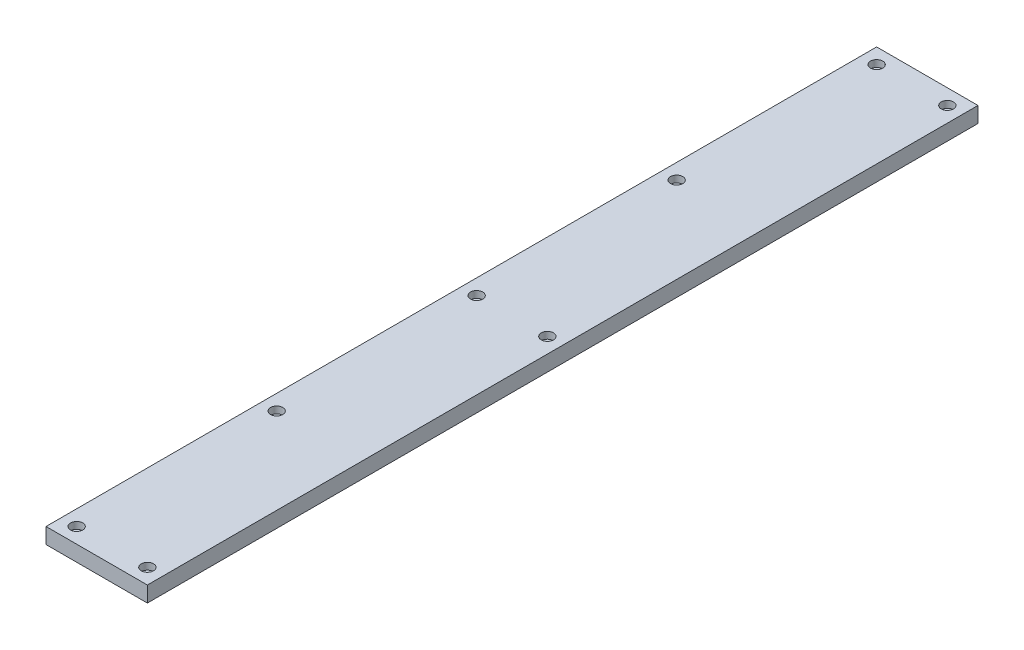
ISO-10303-21;
HEADER;
FILE_DESCRIPTION(('STEP AP214'),'2;1');
FILE_NAME('part.step','',(''),(''),'','','');
FILE_SCHEMA(('AUTOMOTIVE_DESIGN { 1 0 10303 214 1 1 1 1 }'));
ENDSEC;
DATA;
#1=APPLICATION_CONTEXT('core data for automotive mechanical design processes');
#2=APPLICATION_PROTOCOL_DEFINITION('international standard','automotive_design',2000,#1);
#3=PRODUCT_CONTEXT('',#1,'mechanical');
#4=PRODUCT('Part','Part','',(#3));
#5=PRODUCT_RELATED_PRODUCT_CATEGORY('part','',(#4));
#6=PRODUCT_DEFINITION_FORMATION('','',#4);
#7=PRODUCT_DEFINITION_CONTEXT('part definition',#1,'design');
#8=PRODUCT_DEFINITION('design','',#6,#7);
#9=PRODUCT_DEFINITION_SHAPE('','',#8);
#10=(LENGTH_UNIT() NAMED_UNIT(*) SI_UNIT(.MILLI.,.METRE.));
#11=(NAMED_UNIT(*) PLANE_ANGLE_UNIT() SI_UNIT($,.RADIAN.));
#12=(NAMED_UNIT(*) SI_UNIT($,.STERADIAN.) SOLID_ANGLE_UNIT());
#13=UNCERTAINTY_MEASURE_WITH_UNIT(LENGTH_MEASURE(1.E-05),#10,'distance_accuracy_value','');
#14=(GEOMETRIC_REPRESENTATION_CONTEXT(3) GLOBAL_UNCERTAINTY_ASSIGNED_CONTEXT((#13)) GLOBAL_UNIT_ASSIGNED_CONTEXT((#10,
#11,#12)) REPRESENTATION_CONTEXT('',''));
#15=CARTESIAN_POINT('',(0.,0.,0.));
#16=DIRECTION('',(0.,0.,1.));
#17=DIRECTION('',(1.,0.,0.));
#18=AXIS2_PLACEMENT_3D('',#15,#16,#17);
#19=CARTESIAN_POINT('',(-74.4450000000001,23.,-610.));
#20=DIRECTION('',(1.,0.,0.));
#21=DIRECTION('',(0.,0.,-1.));
#22=AXIS2_PLACEMENT_3D('',#19,#20,#21);
#23=PLANE('',#22);
#24=DIRECTION('',(0.,0.,1.));
#25=VECTOR('',#24,1.);
#26=CARTESIAN_POINT('',(-74.4450000000001,0.,-610.));
#27=LINE('',#26,#25);
#28=CARTESIAN_POINT('',(-74.4450000000001,0.,-610.));
#29=VERTEX_POINT('',#28);
#30=CARTESIAN_POINT('',(-74.445,0.,610.));
#31=VERTEX_POINT('',#30);
#32=EDGE_CURVE('E96',#29,#31,#27,.T.);
#33=ORIENTED_EDGE('',*,*,#32,.T.);
#34=DIRECTION('',(0.,-1.,0.));
#35=VECTOR('',#34,1.);
#36=CARTESIAN_POINT('',(-74.445,23.,610.));
#37=LINE('',#36,#35);
#38=CARTESIAN_POINT('',(-74.445,23.,610.));
#39=VERTEX_POINT('',#38);
#40=EDGE_CURVE('E11',#39,#31,#37,.T.);
#41=ORIENTED_EDGE('',*,*,#40,.F.);
#42=DIRECTION('',(0.,0.,1.));
#43=VECTOR('',#42,1.);
#44=CARTESIAN_POINT('',(-74.4450000000001,23.,-610.));
#45=LINE('',#44,#43);
#46=CARTESIAN_POINT('',(-74.4450000000001,23.,-610.));
#47=VERTEX_POINT('',#46);
#48=EDGE_CURVE('E84',#47,#39,#45,.T.);
#49=ORIENTED_EDGE('',*,*,#48,.F.);
#50=DIRECTION('',(0.,-1.,0.));
#51=VECTOR('',#50,1.);
#52=CARTESIAN_POINT('',(-74.4450000000001,23.,-610.));
#53=LINE('',#52,#51);
#54=EDGE_CURVE('E92',#47,#29,#53,.T.);
#55=ORIENTED_EDGE('',*,*,#54,.T.);
#56=EDGE_LOOP('',(#33,#41,#49,#55));
#57=FACE_BOUND('',#56,.T.);
#58=ADVANCED_FACE('F33',(#57),#23,.F.);
#59=CARTESIAN_POINT('',(-74.445,23.,610.));
#60=DIRECTION('',(0.,0.,-1.));
#61=DIRECTION('',(-1.,0.,0.));
#62=AXIS2_PLACEMENT_3D('',#59,#60,#61);
#63=PLANE('',#62);
#64=DIRECTION('',(1.,0.,0.));
#65=VECTOR('',#64,1.);
#66=CARTESIAN_POINT('',(-74.445,0.,610.));
#67=LINE('',#66,#65);
#68=CARTESIAN_POINT('',(74.445,0.,610.));
#69=VERTEX_POINT('',#68);
#70=EDGE_CURVE('E88',#31,#69,#67,.T.);
#71=ORIENTED_EDGE('',*,*,#70,.T.);
#72=DIRECTION('',(0.,-1.,0.));
#73=VECTOR('',#72,1.);
#74=CARTESIAN_POINT('',(74.445,23.,610.));
#75=LINE('',#74,#73);
#76=CARTESIAN_POINT('',(74.445,23.,610.));
#77=VERTEX_POINT('',#76);
#78=EDGE_CURVE('E41',#77,#69,#75,.T.);
#79=ORIENTED_EDGE('',*,*,#78,.F.);
#80=DIRECTION('',(1.,0.,0.));
#81=VECTOR('',#80,1.);
#82=CARTESIAN_POINT('',(-74.445,23.,610.));
#83=LINE('',#82,#81);
#84=EDGE_CURVE('E79',#39,#77,#83,.T.);
#85=ORIENTED_EDGE('',*,*,#84,.F.);
#86=ORIENTED_EDGE('',*,*,#40,.T.);
#87=EDGE_LOOP('',(#71,#79,#85,#86));
#88=FACE_BOUND('',#87,.T.);
#89=ADVANCED_FACE('F87',(#88),#63,.F.);
#90=CARTESIAN_POINT('',(74.4449999999999,23.,-610.));
#91=DIRECTION('',(-1.,0.,0.));
#92=DIRECTION('',(0.,0.,1.));
#93=AXIS2_PLACEMENT_3D('',#90,#91,#92);
#94=PLANE('',#93);
#95=DIRECTION('',(0.,0.,-1.));
#96=VECTOR('',#95,1.);
#97=CARTESIAN_POINT('',(74.4449999999999,0.,-610.));
#98=LINE('',#97,#96);
#99=CARTESIAN_POINT('',(74.4449999999999,0.,-610.));
#100=VERTEX_POINT('',#99);
#101=EDGE_CURVE('E66',#69,#100,#98,.T.);
#102=ORIENTED_EDGE('',*,*,#101,.T.);
#103=DIRECTION('',(0.,-1.,0.));
#104=VECTOR('',#103,1.);
#105=CARTESIAN_POINT('',(74.4449999999999,23.,-610.));
#106=LINE('',#105,#104);
#107=CARTESIAN_POINT('',(74.4449999999999,23.,-610.));
#108=VERTEX_POINT('',#107);
#109=EDGE_CURVE('E89',#108,#100,#106,.T.);
#110=ORIENTED_EDGE('',*,*,#109,.F.);
#111=DIRECTION('',(0.,0.,-1.));
#112=VECTOR('',#111,1.);
#113=CARTESIAN_POINT('',(74.4449999999999,23.,-610.));
#114=LINE('',#113,#112);
#115=EDGE_CURVE('E82',#77,#108,#114,.T.);
#116=ORIENTED_EDGE('',*,*,#115,.F.);
#117=ORIENTED_EDGE('',*,*,#78,.T.);
#118=EDGE_LOOP('',(#102,#110,#116,#117));
#119=FACE_BOUND('',#118,.T.);
#120=ADVANCED_FACE('F90',(#119),#94,.F.);
#121=CARTESIAN_POINT('',(-74.4450000000001,23.,-610.));
#122=DIRECTION('',(0.,0.,1.));
#123=DIRECTION('',(1.,0.,0.));
#124=AXIS2_PLACEMENT_3D('',#121,#122,#123);
#125=PLANE('',#124);
#126=DIRECTION('',(-1.,0.,0.));
#127=VECTOR('',#126,1.);
#128=CARTESIAN_POINT('',(-74.4450000000001,0.,-610.));
#129=LINE('',#128,#127);
#130=EDGE_CURVE('E72',#100,#29,#129,.T.);
#131=ORIENTED_EDGE('',*,*,#130,.T.);
#132=ORIENTED_EDGE('',*,*,#54,.F.);
#133=DIRECTION('',(-1.,0.,0.));
#134=VECTOR('',#133,1.);
#135=CARTESIAN_POINT('',(-74.4450000000001,23.,-610.));
#136=LINE('',#135,#134);
#137=EDGE_CURVE('E49',#108,#47,#136,.T.);
#138=ORIENTED_EDGE('',*,*,#137,.F.);
#139=ORIENTED_EDGE('',*,*,#109,.T.);
#140=EDGE_LOOP('',(#131,#132,#138,#139));
#141=FACE_BOUND('',#140,.T.);
#142=ADVANCED_FACE('F104',(#141),#125,.F.);
#143=CARTESIAN_POINT('',(0.,23.,0.));
#144=DIRECTION('',(0.,1.,0.));
#145=DIRECTION('',(0.,0.,1.));
#146=AXIS2_PLACEMENT_3D('',#143,#144,#145);
#147=PLANE('',#146);
#148=CARTESIAN_POINT('',(-51.9450000000001,23.,-587.5));
#149=DIRECTION('',(0.,1.,0.));
#150=DIRECTION('',(0.,0.,1.));
#151=AXIS2_PLACEMENT_3D('',#148,#149,#150);
#152=CIRCLE('',#151,9.0055);
#153=CARTESIAN_POINT('',(-51.9450000000001,23.,-578.4945));
#154=VERTEX_POINT('',#153);
#155=EDGE_CURVE('E202',#154,#154,#152,.T.);
#156=ORIENTED_EDGE('',*,*,#155,.F.);
#157=EDGE_LOOP('',(#156));
#158=FACE_BOUND('',#157,.T.);
#159=CARTESIAN_POINT('',(51.945,23.,-587.5));
#160=DIRECTION('',(0.,1.,0.));
#161=DIRECTION('',(0.,0.,1.));
#162=AXIS2_PLACEMENT_3D('',#159,#160,#161);
#163=CIRCLE('',#162,9.0055);
#164=CARTESIAN_POINT('',(51.945,23.,-578.4945));
#165=VERTEX_POINT('',#164);
#166=EDGE_CURVE('E190',#165,#165,#163,.T.);
#167=ORIENTED_EDGE('',*,*,#166,.F.);
#168=EDGE_LOOP('',(#167));
#169=FACE_BOUND('',#168,.T.);
#170=CARTESIAN_POINT('',(-51.9450000000001,23.,0.));
#171=DIRECTION('',(0.,1.,0.));
#172=DIRECTION('',(0.,0.,1.));
#173=AXIS2_PLACEMENT_3D('',#170,#171,#172);
#174=CIRCLE('',#173,9.0055);
#175=CARTESIAN_POINT('',(-51.9450000000001,23.,9.0055));
#176=VERTEX_POINT('',#175);
#177=EDGE_CURVE('E178',#176,#176,#174,.T.);
#178=ORIENTED_EDGE('',*,*,#177,.F.);
#179=EDGE_LOOP('',(#178));
#180=FACE_BOUND('',#179,.T.);
#181=CARTESIAN_POINT('',(51.945,23.,0.));
#182=DIRECTION('',(0.,1.,0.));
#183=DIRECTION('',(0.,0.,1.));
#184=AXIS2_PLACEMENT_3D('',#181,#182,#183);
#185=CIRCLE('',#184,9.0055);
#186=CARTESIAN_POINT('',(51.945,23.,9.0055));
#187=VERTEX_POINT('',#186);
#188=EDGE_CURVE('E166',#187,#187,#185,.T.);
#189=ORIENTED_EDGE('',*,*,#188,.F.);
#190=EDGE_LOOP('',(#189));
#191=FACE_BOUND('',#190,.T.);
#192=CARTESIAN_POINT('',(-51.9450000000001,23.,587.5));
#193=DIRECTION('',(0.,1.,0.));
#194=DIRECTION('',(0.,0.,1.));
#195=AXIS2_PLACEMENT_3D('',#192,#193,#194);
#196=CIRCLE('',#195,9.0055);
#197=CARTESIAN_POINT('',(-51.9450000000001,23.,596.5055));
#198=VERTEX_POINT('',#197);
#199=EDGE_CURVE('E154',#198,#198,#196,.T.);
#200=ORIENTED_EDGE('',*,*,#199,.F.);
#201=EDGE_LOOP('',(#200));
#202=FACE_BOUND('',#201,.T.);
#203=CARTESIAN_POINT('',(51.945,23.,587.5));
#204=DIRECTION('',(0.,1.,0.));
#205=DIRECTION('',(0.,0.,1.));
#206=AXIS2_PLACEMENT_3D('',#203,#204,#205);
#207=CIRCLE('',#206,9.0055);
#208=CARTESIAN_POINT('',(51.945,23.,596.5055));
#209=VERTEX_POINT('',#208);
#210=EDGE_CURVE('E142',#209,#209,#207,.T.);
#211=ORIENTED_EDGE('',*,*,#210,.F.);
#212=EDGE_LOOP('',(#211));
#213=FACE_BOUND('',#212,.T.);
#214=CARTESIAN_POINT('',(-51.9450000000001,23.,293.75));
#215=DIRECTION('',(0.,1.,0.));
#216=DIRECTION('',(0.,0.,1.));
#217=AXIS2_PLACEMENT_3D('',#214,#215,#216);
#218=CIRCLE('',#217,9.0055);
#219=CARTESIAN_POINT('',(-51.9450000000001,23.,302.7555));
#220=VERTEX_POINT('',#219);
#221=EDGE_CURVE('E130',#220,#220,#218,.T.);
#222=ORIENTED_EDGE('',*,*,#221,.F.);
#223=EDGE_LOOP('',(#222));
#224=FACE_BOUND('',#223,.T.);
#225=CARTESIAN_POINT('',(-51.9450000000001,23.,-293.75));
#226=DIRECTION('',(0.,1.,0.));
#227=DIRECTION('',(0.,0.,1.));
#228=AXIS2_PLACEMENT_3D('',#225,#226,#227);
#229=CIRCLE('',#228,9.0055);
#230=CARTESIAN_POINT('',(-51.9450000000001,23.,-284.7445));
#231=VERTEX_POINT('',#230);
#232=EDGE_CURVE('E118',#231,#231,#229,.T.);
#233=ORIENTED_EDGE('',*,*,#232,.F.);
#234=EDGE_LOOP('',(#233));
#235=FACE_BOUND('',#234,.T.);
#236=ORIENTED_EDGE('',*,*,#48,.T.);
#237=ORIENTED_EDGE('',*,*,#84,.T.);
#238=ORIENTED_EDGE('',*,*,#115,.T.);
#239=ORIENTED_EDGE('',*,*,#137,.T.);
#240=EDGE_LOOP('',(#236,#237,#238,#239));
#241=FACE_BOUND('',#240,.T.);
#242=ADVANCED_FACE('F80',(#158,#169,#180,#191,#202,#213,#224,#235,#241),#147,.T.);
#243=CARTESIAN_POINT('',(0.,0.,0.));
#244=DIRECTION('',(0.,1.,0.));
#245=DIRECTION('',(0.,0.,1.));
#246=AXIS2_PLACEMENT_3D('',#243,#244,#245);
#247=PLANE('',#246);
#248=CARTESIAN_POINT('',(-51.9450000000001,0.,-587.5));
#249=DIRECTION('',(0.,1.,0.));
#250=DIRECTION('',(0.,0.,1.));
#251=AXIS2_PLACEMENT_3D('',#248,#249,#250);
#252=CIRCLE('',#251,4.50000000000001);
#253=CARTESIAN_POINT('',(-51.9450000000001,0.,-583.));
#254=VERTEX_POINT('',#253);
#255=EDGE_CURVE('E193',#254,#254,#252,.T.);
#256=ORIENTED_EDGE('',*,*,#255,.T.);
#257=EDGE_LOOP('',(#256));
#258=FACE_BOUND('',#257,.T.);
#259=CARTESIAN_POINT('',(51.945,0.,-587.5));
#260=DIRECTION('',(0.,1.,0.));
#261=DIRECTION('',(0.,0.,1.));
#262=AXIS2_PLACEMENT_3D('',#259,#260,#261);
#263=CIRCLE('',#262,4.50000000000001);
#264=CARTESIAN_POINT('',(51.945,0.,-583.));
#265=VERTEX_POINT('',#264);
#266=EDGE_CURVE('E181',#265,#265,#263,.T.);
#267=ORIENTED_EDGE('',*,*,#266,.T.);
#268=EDGE_LOOP('',(#267));
#269=FACE_BOUND('',#268,.T.);
#270=CARTESIAN_POINT('',(-51.9450000000001,0.,0.));
#271=DIRECTION('',(0.,1.,0.));
#272=DIRECTION('',(0.,0.,1.));
#273=AXIS2_PLACEMENT_3D('',#270,#271,#272);
#274=CIRCLE('',#273,4.50000000000001);
#275=CARTESIAN_POINT('',(-51.9450000000001,0.,4.50000000000001));
#276=VERTEX_POINT('',#275);
#277=EDGE_CURVE('E169',#276,#276,#274,.T.);
#278=ORIENTED_EDGE('',*,*,#277,.T.);
#279=EDGE_LOOP('',(#278));
#280=FACE_BOUND('',#279,.T.);
#281=CARTESIAN_POINT('',(51.945,0.,0.));
#282=DIRECTION('',(0.,1.,0.));
#283=DIRECTION('',(0.,0.,1.));
#284=AXIS2_PLACEMENT_3D('',#281,#282,#283);
#285=CIRCLE('',#284,4.50000000000001);
#286=CARTESIAN_POINT('',(51.945,0.,4.50000000000001));
#287=VERTEX_POINT('',#286);
#288=EDGE_CURVE('E157',#287,#287,#285,.T.);
#289=ORIENTED_EDGE('',*,*,#288,.T.);
#290=EDGE_LOOP('',(#289));
#291=FACE_BOUND('',#290,.T.);
#292=CARTESIAN_POINT('',(-51.9450000000001,0.,587.5));
#293=DIRECTION('',(0.,1.,0.));
#294=DIRECTION('',(0.,0.,1.));
#295=AXIS2_PLACEMENT_3D('',#292,#293,#294);
#296=CIRCLE('',#295,4.50000000000001);
#297=CARTESIAN_POINT('',(-51.9450000000001,0.,592.));
#298=VERTEX_POINT('',#297);
#299=EDGE_CURVE('E145',#298,#298,#296,.T.);
#300=ORIENTED_EDGE('',*,*,#299,.T.);
#301=EDGE_LOOP('',(#300));
#302=FACE_BOUND('',#301,.T.);
#303=CARTESIAN_POINT('',(51.945,0.,587.5));
#304=DIRECTION('',(0.,1.,0.));
#305=DIRECTION('',(0.,0.,1.));
#306=AXIS2_PLACEMENT_3D('',#303,#304,#305);
#307=CIRCLE('',#306,4.50000000000001);
#308=CARTESIAN_POINT('',(51.945,0.,592.));
#309=VERTEX_POINT('',#308);
#310=EDGE_CURVE('E133',#309,#309,#307,.T.);
#311=ORIENTED_EDGE('',*,*,#310,.T.);
#312=EDGE_LOOP('',(#311));
#313=FACE_BOUND('',#312,.T.);
#314=CARTESIAN_POINT('',(-51.9450000000001,0.,293.75));
#315=DIRECTION('',(0.,1.,0.));
#316=DIRECTION('',(0.,0.,1.));
#317=AXIS2_PLACEMENT_3D('',#314,#315,#316);
#318=CIRCLE('',#317,4.50000000000001);
#319=CARTESIAN_POINT('',(-51.9450000000001,0.,298.25));
#320=VERTEX_POINT('',#319);
#321=EDGE_CURVE('E121',#320,#320,#318,.T.);
#322=ORIENTED_EDGE('',*,*,#321,.T.);
#323=EDGE_LOOP('',(#322));
#324=FACE_BOUND('',#323,.T.);
#325=CARTESIAN_POINT('',(-51.9450000000001,0.,-293.75));
#326=DIRECTION('',(0.,1.,0.));
#327=DIRECTION('',(0.,0.,1.));
#328=AXIS2_PLACEMENT_3D('',#325,#326,#327);
#329=CIRCLE('',#328,4.50000000000001);
#330=CARTESIAN_POINT('',(-51.9450000000001,0.,-289.25));
#331=VERTEX_POINT('',#330);
#332=EDGE_CURVE('E99',#331,#331,#329,.T.);
#333=ORIENTED_EDGE('',*,*,#332,.T.);
#334=EDGE_LOOP('',(#333));
#335=FACE_BOUND('',#334,.T.);
#336=ORIENTED_EDGE('',*,*,#32,.F.);
#337=ORIENTED_EDGE('',*,*,#130,.F.);
#338=ORIENTED_EDGE('',*,*,#101,.F.);
#339=ORIENTED_EDGE('',*,*,#70,.F.);
#340=EDGE_LOOP('',(#336,#337,#338,#339));
#341=FACE_BOUND('',#340,.T.);
#342=ADVANCED_FACE('F107',(#258,#269,#280,#291,#302,#313,#324,#335,#341),#247,.F.);
#343=CARTESIAN_POINT('',(-51.9450000000001,23.,-293.75));
#344=DIRECTION('',(0.,1.,0.));
#345=DIRECTION('',(0.,0.,1.));
#346=AXIS2_PLACEMENT_3D('',#343,#344,#345);
#347=CYLINDRICAL_SURFACE('',#346,4.50000000000001);
#348=ORIENTED_EDGE('',*,*,#332,.F.);
#349=EDGE_LOOP('',(#348));
#350=FACE_BOUND('',#349,.T.);
#351=CARTESIAN_POINT('',(-51.9450000000001,13.,-293.75));
#352=DIRECTION('',(0.,1.,0.));
#353=DIRECTION('',(0.,0.,1.));
#354=AXIS2_PLACEMENT_3D('',#351,#352,#353);
#355=CIRCLE('',#354,4.50000000000002);
#356=CARTESIAN_POINT('',(-51.9450000000001,13.,-289.25));
#357=VERTEX_POINT('',#356);
#358=EDGE_CURVE('E112',#357,#357,#355,.T.);
#359=ORIENTED_EDGE('',*,*,#358,.T.);
#360=EDGE_LOOP('',(#359));
#361=FACE_BOUND('',#360,.T.);
#362=ADVANCED_FACE('F238',(#350,#361),#347,.F.);
#363=CARTESIAN_POINT('',(-47.4450000000001,13.,-293.75));
#364=DIRECTION('',(0.,-1.,0.));
#365=DIRECTION('',(0.,0.,-1.));
#366=AXIS2_PLACEMENT_3D('',#363,#364,#365);
#367=PLANE('',#366);
#368=ORIENTED_EDGE('',*,*,#358,.F.);
#369=EDGE_LOOP('',(#368));
#370=FACE_BOUND('',#369,.T.);
#371=CARTESIAN_POINT('',(-51.9450000000001,13.,-293.75));
#372=DIRECTION('',(0.,1.,0.));
#373=DIRECTION('',(0.,0.,1.));
#374=AXIS2_PLACEMENT_3D('',#371,#372,#373);
#375=CIRCLE('',#374,9.0055);
#376=CARTESIAN_POINT('',(-51.9450000000001,13.,-284.7445));
#377=VERTEX_POINT('',#376);
#378=EDGE_CURVE('E115',#377,#377,#375,.T.);
#379=ORIENTED_EDGE('',*,*,#378,.T.);
#380=EDGE_LOOP('',(#379));
#381=FACE_BOUND('',#380,.T.);
#382=ADVANCED_FACE('F228',(#370,#381),#367,.F.);
#383=CARTESIAN_POINT('',(-51.9450000000001,23.,-293.75));
#384=DIRECTION('',(0.,1.,0.));
#385=DIRECTION('',(0.,0.,1.));
#386=AXIS2_PLACEMENT_3D('',#383,#384,#385);
#387=CYLINDRICAL_SURFACE('',#386,9.0055);
#388=ORIENTED_EDGE('',*,*,#378,.F.);
#389=EDGE_LOOP('',(#388));
#390=FACE_BOUND('',#389,.T.);
#391=ORIENTED_EDGE('',*,*,#232,.T.);
#392=EDGE_LOOP('',(#391));
#393=FACE_BOUND('',#392,.T.);
#394=ADVANCED_FACE('F225',(#390,#393),#387,.F.);
#395=CARTESIAN_POINT('',(-51.9450000000001,23.,293.75));
#396=DIRECTION('',(0.,1.,0.));
#397=DIRECTION('',(0.,0.,1.));
#398=AXIS2_PLACEMENT_3D('',#395,#396,#397);
#399=CYLINDRICAL_SURFACE('',#398,4.50000000000001);
#400=ORIENTED_EDGE('',*,*,#321,.F.);
#401=EDGE_LOOP('',(#400));
#402=FACE_BOUND('',#401,.T.);
#403=CARTESIAN_POINT('',(-51.9450000000001,13.,293.75));
#404=DIRECTION('',(0.,1.,0.));
#405=DIRECTION('',(0.,0.,1.));
#406=AXIS2_PLACEMENT_3D('',#403,#404,#405);
#407=CIRCLE('',#406,4.50000000000002);
#408=CARTESIAN_POINT('',(-51.9450000000001,13.,298.25));
#409=VERTEX_POINT('',#408);
#410=EDGE_CURVE('E124',#409,#409,#407,.T.);
#411=ORIENTED_EDGE('',*,*,#410,.T.);
#412=EDGE_LOOP('',(#411));
#413=FACE_BOUND('',#412,.T.);
#414=ADVANCED_FACE('F227',(#402,#413),#399,.F.);
#415=CARTESIAN_POINT('',(-47.4450000000001,13.,293.75));
#416=DIRECTION('',(0.,-1.,0.));
#417=DIRECTION('',(0.,0.,-1.));
#418=AXIS2_PLACEMENT_3D('',#415,#416,#417);
#419=PLANE('',#418);
#420=ORIENTED_EDGE('',*,*,#410,.F.);
#421=EDGE_LOOP('',(#420));
#422=FACE_BOUND('',#421,.T.);
#423=CARTESIAN_POINT('',(-51.9450000000001,13.,293.75));
#424=DIRECTION('',(0.,1.,0.));
#425=DIRECTION('',(0.,0.,1.));
#426=AXIS2_PLACEMENT_3D('',#423,#424,#425);
#427=CIRCLE('',#426,9.0055);
#428=CARTESIAN_POINT('',(-51.9450000000001,13.,302.7555));
#429=VERTEX_POINT('',#428);
#430=EDGE_CURVE('E127',#429,#429,#427,.T.);
#431=ORIENTED_EDGE('',*,*,#430,.T.);
#432=EDGE_LOOP('',(#431));
#433=FACE_BOUND('',#432,.T.);
#434=ADVANCED_FACE('F235',(#422,#433),#419,.F.);
#435=CARTESIAN_POINT('',(-51.9450000000001,23.,293.75));
#436=DIRECTION('',(0.,1.,0.));
#437=DIRECTION('',(0.,0.,1.));
#438=AXIS2_PLACEMENT_3D('',#435,#436,#437);
#439=CYLINDRICAL_SURFACE('',#438,9.0055);
#440=ORIENTED_EDGE('',*,*,#430,.F.);
#441=EDGE_LOOP('',(#440));
#442=FACE_BOUND('',#441,.T.);
#443=ORIENTED_EDGE('',*,*,#221,.T.);
#444=EDGE_LOOP('',(#443));
#445=FACE_BOUND('',#444,.T.);
#446=ADVANCED_FACE('F290',(#442,#445),#439,.F.);
#447=CARTESIAN_POINT('',(51.945,23.,587.5));
#448=DIRECTION('',(0.,1.,0.));
#449=DIRECTION('',(0.,0.,1.));
#450=AXIS2_PLACEMENT_3D('',#447,#448,#449);
#451=CYLINDRICAL_SURFACE('',#450,4.50000000000001);
#452=ORIENTED_EDGE('',*,*,#310,.F.);
#453=EDGE_LOOP('',(#452));
#454=FACE_BOUND('',#453,.T.);
#455=CARTESIAN_POINT('',(51.945,13.,587.5));
#456=DIRECTION('',(0.,1.,0.));
#457=DIRECTION('',(0.,0.,1.));
#458=AXIS2_PLACEMENT_3D('',#455,#456,#457);
#459=CIRCLE('',#458,4.50000000000001);
#460=CARTESIAN_POINT('',(51.945,13.,592.));
#461=VERTEX_POINT('',#460);
#462=EDGE_CURVE('E136',#461,#461,#459,.T.);
#463=ORIENTED_EDGE('',*,*,#462,.T.);
#464=EDGE_LOOP('',(#463));
#465=FACE_BOUND('',#464,.T.);
#466=ADVANCED_FACE('F300',(#454,#465),#451,.F.);
#467=CARTESIAN_POINT('',(56.445,13.,587.5));
#468=DIRECTION('',(0.,-1.,0.));
#469=DIRECTION('',(0.,0.,-1.));
#470=AXIS2_PLACEMENT_3D('',#467,#468,#469);
#471=PLANE('',#470);
#472=ORIENTED_EDGE('',*,*,#462,.F.);
#473=EDGE_LOOP('',(#472));
#474=FACE_BOUND('',#473,.T.);
#475=CARTESIAN_POINT('',(51.945,13.,587.5));
#476=DIRECTION('',(0.,1.,0.));
#477=DIRECTION('',(0.,0.,1.));
#478=AXIS2_PLACEMENT_3D('',#475,#476,#477);
#479=CIRCLE('',#478,9.0055);
#480=CARTESIAN_POINT('',(51.945,13.,596.5055));
#481=VERTEX_POINT('',#480);
#482=EDGE_CURVE('E139',#481,#481,#479,.T.);
#483=ORIENTED_EDGE('',*,*,#482,.T.);
#484=EDGE_LOOP('',(#483));
#485=FACE_BOUND('',#484,.T.);
#486=ADVANCED_FACE('F310',(#474,#485),#471,.F.);
#487=CARTESIAN_POINT('',(51.945,23.,587.5));
#488=DIRECTION('',(0.,1.,0.));
#489=DIRECTION('',(0.,0.,1.));
#490=AXIS2_PLACEMENT_3D('',#487,#488,#489);
#491=CYLINDRICAL_SURFACE('',#490,9.0055);
#492=ORIENTED_EDGE('',*,*,#482,.F.);
#493=EDGE_LOOP('',(#492));
#494=FACE_BOUND('',#493,.T.);
#495=ORIENTED_EDGE('',*,*,#210,.T.);
#496=EDGE_LOOP('',(#495));
#497=FACE_BOUND('',#496,.T.);
#498=ADVANCED_FACE('F320',(#494,#497),#491,.F.);
#499=CARTESIAN_POINT('',(-51.9450000000001,23.,587.5));
#500=DIRECTION('',(0.,1.,0.));
#501=DIRECTION('',(0.,0.,1.));
#502=AXIS2_PLACEMENT_3D('',#499,#500,#501);
#503=CYLINDRICAL_SURFACE('',#502,4.50000000000001);
#504=ORIENTED_EDGE('',*,*,#299,.F.);
#505=EDGE_LOOP('',(#504));
#506=FACE_BOUND('',#505,.T.);
#507=CARTESIAN_POINT('',(-51.9450000000001,13.,587.5));
#508=DIRECTION('',(0.,1.,0.));
#509=DIRECTION('',(0.,0.,1.));
#510=AXIS2_PLACEMENT_3D('',#507,#508,#509);
#511=CIRCLE('',#510,4.50000000000002);
#512=CARTESIAN_POINT('',(-51.9450000000001,13.,592.));
#513=VERTEX_POINT('',#512);
#514=EDGE_CURVE('E148',#513,#513,#511,.T.);
#515=ORIENTED_EDGE('',*,*,#514,.T.);
#516=EDGE_LOOP('',(#515));
#517=FACE_BOUND('',#516,.T.);
#518=ADVANCED_FACE('F330',(#506,#517),#503,.F.);
#519=CARTESIAN_POINT('',(-47.4450000000001,13.,587.5));
#520=DIRECTION('',(0.,-1.,0.));
#521=DIRECTION('',(0.,0.,-1.));
#522=AXIS2_PLACEMENT_3D('',#519,#520,#521);
#523=PLANE('',#522);
#524=ORIENTED_EDGE('',*,*,#514,.F.);
#525=EDGE_LOOP('',(#524));
#526=FACE_BOUND('',#525,.T.);
#527=CARTESIAN_POINT('',(-51.9450000000001,13.,587.5));
#528=DIRECTION('',(0.,1.,0.));
#529=DIRECTION('',(0.,0.,1.));
#530=AXIS2_PLACEMENT_3D('',#527,#528,#529);
#531=CIRCLE('',#530,9.0055);
#532=CARTESIAN_POINT('',(-51.9450000000001,13.,596.5055));
#533=VERTEX_POINT('',#532);
#534=EDGE_CURVE('E151',#533,#533,#531,.T.);
#535=ORIENTED_EDGE('',*,*,#534,.T.);
#536=EDGE_LOOP('',(#535));
#537=FACE_BOUND('',#536,.T.);
#538=ADVANCED_FACE('F340',(#526,#537),#523,.F.);
#539=CARTESIAN_POINT('',(-51.9450000000001,23.,587.5));
#540=DIRECTION('',(0.,1.,0.));
#541=DIRECTION('',(0.,0.,1.));
#542=AXIS2_PLACEMENT_3D('',#539,#540,#541);
#543=CYLINDRICAL_SURFACE('',#542,9.0055);
#544=ORIENTED_EDGE('',*,*,#534,.F.);
#545=EDGE_LOOP('',(#544));
#546=FACE_BOUND('',#545,.T.);
#547=ORIENTED_EDGE('',*,*,#199,.T.);
#548=EDGE_LOOP('',(#547));
#549=FACE_BOUND('',#548,.T.);
#550=ADVANCED_FACE('F350',(#546,#549),#543,.F.);
#551=CARTESIAN_POINT('',(51.945,23.,0.));
#552=DIRECTION('',(0.,1.,0.));
#553=DIRECTION('',(0.,0.,1.));
#554=AXIS2_PLACEMENT_3D('',#551,#552,#553);
#555=CYLINDRICAL_SURFACE('',#554,4.50000000000001);
#556=ORIENTED_EDGE('',*,*,#288,.F.);
#557=EDGE_LOOP('',(#556));
#558=FACE_BOUND('',#557,.T.);
#559=CARTESIAN_POINT('',(51.945,13.,0.));
#560=DIRECTION('',(0.,1.,0.));
#561=DIRECTION('',(0.,0.,1.));
#562=AXIS2_PLACEMENT_3D('',#559,#560,#561);
#563=CIRCLE('',#562,4.50000000000001);
#564=CARTESIAN_POINT('',(51.945,13.,4.50000000000001));
#565=VERTEX_POINT('',#564);
#566=EDGE_CURVE('E160',#565,#565,#563,.T.);
#567=ORIENTED_EDGE('',*,*,#566,.T.);
#568=EDGE_LOOP('',(#567));
#569=FACE_BOUND('',#568,.T.);
#570=ADVANCED_FACE('F360',(#558,#569),#555,.F.);
#571=CARTESIAN_POINT('',(56.445,13.,0.));
#572=DIRECTION('',(0.,-1.,0.));
#573=DIRECTION('',(0.,0.,-1.));
#574=AXIS2_PLACEMENT_3D('',#571,#572,#573);
#575=PLANE('',#574);
#576=ORIENTED_EDGE('',*,*,#566,.F.);
#577=EDGE_LOOP('',(#576));
#578=FACE_BOUND('',#577,.T.);
#579=CARTESIAN_POINT('',(51.945,13.,0.));
#580=DIRECTION('',(0.,1.,0.));
#581=DIRECTION('',(0.,0.,1.));
#582=AXIS2_PLACEMENT_3D('',#579,#580,#581);
#583=CIRCLE('',#582,9.0055);
#584=CARTESIAN_POINT('',(51.945,13.,9.0055));
#585=VERTEX_POINT('',#584);
#586=EDGE_CURVE('E163',#585,#585,#583,.T.);
#587=ORIENTED_EDGE('',*,*,#586,.T.);
#588=EDGE_LOOP('',(#587));
#589=FACE_BOUND('',#588,.T.);
#590=ADVANCED_FACE('F370',(#578,#589),#575,.F.);
#591=CARTESIAN_POINT('',(51.945,23.,0.));
#592=DIRECTION('',(0.,1.,0.));
#593=DIRECTION('',(0.,0.,1.));
#594=AXIS2_PLACEMENT_3D('',#591,#592,#593);
#595=CYLINDRICAL_SURFACE('',#594,9.0055);
#596=ORIENTED_EDGE('',*,*,#586,.F.);
#597=EDGE_LOOP('',(#596));
#598=FACE_BOUND('',#597,.T.);
#599=ORIENTED_EDGE('',*,*,#188,.T.);
#600=EDGE_LOOP('',(#599));
#601=FACE_BOUND('',#600,.T.);
#602=ADVANCED_FACE('F380',(#598,#601),#595,.F.);
#603=CARTESIAN_POINT('',(-51.9450000000001,23.,0.));
#604=DIRECTION('',(0.,1.,0.));
#605=DIRECTION('',(0.,0.,1.));
#606=AXIS2_PLACEMENT_3D('',#603,#604,#605);
#607=CYLINDRICAL_SURFACE('',#606,4.50000000000001);
#608=ORIENTED_EDGE('',*,*,#277,.F.);
#609=EDGE_LOOP('',(#608));
#610=FACE_BOUND('',#609,.T.);
#611=CARTESIAN_POINT('',(-51.9450000000001,13.,0.));
#612=DIRECTION('',(0.,1.,0.));
#613=DIRECTION('',(0.,0.,1.));
#614=AXIS2_PLACEMENT_3D('',#611,#612,#613);
#615=CIRCLE('',#614,4.50000000000001);
#616=CARTESIAN_POINT('',(-51.9450000000001,13.,4.50000000000001));
#617=VERTEX_POINT('',#616);
#618=EDGE_CURVE('E172',#617,#617,#615,.T.);
#619=ORIENTED_EDGE('',*,*,#618,.T.);
#620=EDGE_LOOP('',(#619));
#621=FACE_BOUND('',#620,.T.);
#622=ADVANCED_FACE('F390',(#610,#621),#607,.F.);
#623=CARTESIAN_POINT('',(-47.4450000000001,13.,0.));
#624=DIRECTION('',(0.,-1.,0.));
#625=DIRECTION('',(0.,0.,-1.));
#626=AXIS2_PLACEMENT_3D('',#623,#624,#625);
#627=PLANE('',#626);
#628=ORIENTED_EDGE('',*,*,#618,.F.);
#629=EDGE_LOOP('',(#628));
#630=FACE_BOUND('',#629,.T.);
#631=CARTESIAN_POINT('',(-51.9450000000001,13.,0.));
#632=DIRECTION('',(0.,1.,0.));
#633=DIRECTION('',(0.,0.,1.));
#634=AXIS2_PLACEMENT_3D('',#631,#632,#633);
#635=CIRCLE('',#634,9.0055);
#636=CARTESIAN_POINT('',(-51.9450000000001,13.,9.0055));
#637=VERTEX_POINT('',#636);
#638=EDGE_CURVE('E175',#637,#637,#635,.T.);
#639=ORIENTED_EDGE('',*,*,#638,.T.);
#640=EDGE_LOOP('',(#639));
#641=FACE_BOUND('',#640,.T.);
#642=ADVANCED_FACE('F400',(#630,#641),#627,.F.);
#643=CARTESIAN_POINT('',(-51.9450000000001,23.,0.));
#644=DIRECTION('',(0.,1.,0.));
#645=DIRECTION('',(0.,0.,1.));
#646=AXIS2_PLACEMENT_3D('',#643,#644,#645);
#647=CYLINDRICAL_SURFACE('',#646,9.0055);
#648=ORIENTED_EDGE('',*,*,#638,.F.);
#649=EDGE_LOOP('',(#648));
#650=FACE_BOUND('',#649,.T.);
#651=ORIENTED_EDGE('',*,*,#177,.T.);
#652=EDGE_LOOP('',(#651));
#653=FACE_BOUND('',#652,.T.);
#654=ADVANCED_FACE('F410',(#650,#653),#647,.F.);
#655=CARTESIAN_POINT('',(51.945,23.,-587.5));
#656=DIRECTION('',(0.,1.,0.));
#657=DIRECTION('',(0.,0.,1.));
#658=AXIS2_PLACEMENT_3D('',#655,#656,#657);
#659=CYLINDRICAL_SURFACE('',#658,4.50000000000001);
#660=ORIENTED_EDGE('',*,*,#266,.F.);
#661=EDGE_LOOP('',(#660));
#662=FACE_BOUND('',#661,.T.);
#663=CARTESIAN_POINT('',(51.945,13.,-587.5));
#664=DIRECTION('',(0.,1.,0.));
#665=DIRECTION('',(0.,0.,1.));
#666=AXIS2_PLACEMENT_3D('',#663,#664,#665);
#667=CIRCLE('',#666,4.50000000000001);
#668=CARTESIAN_POINT('',(51.945,13.,-583.));
#669=VERTEX_POINT('',#668);
#670=EDGE_CURVE('E184',#669,#669,#667,.T.);
#671=ORIENTED_EDGE('',*,*,#670,.T.);
#672=EDGE_LOOP('',(#671));
#673=FACE_BOUND('',#672,.T.);
#674=ADVANCED_FACE('F420',(#662,#673),#659,.F.);
#675=CARTESIAN_POINT('',(56.445,13.,-587.5));
#676=DIRECTION('',(0.,-1.,0.));
#677=DIRECTION('',(0.,0.,-1.));
#678=AXIS2_PLACEMENT_3D('',#675,#676,#677);
#679=PLANE('',#678);
#680=ORIENTED_EDGE('',*,*,#670,.F.);
#681=EDGE_LOOP('',(#680));
#682=FACE_BOUND('',#681,.T.);
#683=CARTESIAN_POINT('',(51.945,13.,-587.5));
#684=DIRECTION('',(0.,1.,0.));
#685=DIRECTION('',(0.,0.,1.));
#686=AXIS2_PLACEMENT_3D('',#683,#684,#685);
#687=CIRCLE('',#686,9.0055);
#688=CARTESIAN_POINT('',(51.945,13.,-578.4945));
#689=VERTEX_POINT('',#688);
#690=EDGE_CURVE('E187',#689,#689,#687,.T.);
#691=ORIENTED_EDGE('',*,*,#690,.T.);
#692=EDGE_LOOP('',(#691));
#693=FACE_BOUND('',#692,.T.);
#694=ADVANCED_FACE('F430',(#682,#693),#679,.F.);
#695=CARTESIAN_POINT('',(51.945,23.,-587.5));
#696=DIRECTION('',(0.,1.,0.));
#697=DIRECTION('',(0.,0.,1.));
#698=AXIS2_PLACEMENT_3D('',#695,#696,#697);
#699=CYLINDRICAL_SURFACE('',#698,9.0055);
#700=ORIENTED_EDGE('',*,*,#690,.F.);
#701=EDGE_LOOP('',(#700));
#702=FACE_BOUND('',#701,.T.);
#703=ORIENTED_EDGE('',*,*,#166,.T.);
#704=EDGE_LOOP('',(#703));
#705=FACE_BOUND('',#704,.T.);
#706=ADVANCED_FACE('F440',(#702,#705),#699,.F.);
#707=CARTESIAN_POINT('',(-51.9450000000001,23.,-587.5));
#708=DIRECTION('',(0.,1.,0.));
#709=DIRECTION('',(0.,0.,1.));
#710=AXIS2_PLACEMENT_3D('',#707,#708,#709);
#711=CYLINDRICAL_SURFACE('',#710,4.50000000000001);
#712=ORIENTED_EDGE('',*,*,#255,.F.);
#713=EDGE_LOOP('',(#712));
#714=FACE_BOUND('',#713,.T.);
#715=CARTESIAN_POINT('',(-51.9450000000001,13.,-587.5));
#716=DIRECTION('',(0.,1.,0.));
#717=DIRECTION('',(0.,0.,1.));
#718=AXIS2_PLACEMENT_3D('',#715,#716,#717);
#719=CIRCLE('',#718,4.50000000000002);
#720=CARTESIAN_POINT('',(-51.9450000000001,13.,-583.));
#721=VERTEX_POINT('',#720);
#722=EDGE_CURVE('E196',#721,#721,#719,.T.);
#723=ORIENTED_EDGE('',*,*,#722,.T.);
#724=EDGE_LOOP('',(#723));
#725=FACE_BOUND('',#724,.T.);
#726=ADVANCED_FACE('F450',(#714,#725),#711,.F.);
#727=CARTESIAN_POINT('',(-47.4450000000001,13.,-587.5));
#728=DIRECTION('',(0.,-1.,0.));
#729=DIRECTION('',(0.,0.,-1.));
#730=AXIS2_PLACEMENT_3D('',#727,#728,#729);
#731=PLANE('',#730);
#732=ORIENTED_EDGE('',*,*,#722,.F.);
#733=EDGE_LOOP('',(#732));
#734=FACE_BOUND('',#733,.T.);
#735=CARTESIAN_POINT('',(-51.9450000000001,13.,-587.5));
#736=DIRECTION('',(0.,1.,0.));
#737=DIRECTION('',(0.,0.,1.));
#738=AXIS2_PLACEMENT_3D('',#735,#736,#737);
#739=CIRCLE('',#738,9.0055);
#740=CARTESIAN_POINT('',(-51.9450000000001,13.,-578.4945));
#741=VERTEX_POINT('',#740);
#742=EDGE_CURVE('E199',#741,#741,#739,.T.);
#743=ORIENTED_EDGE('',*,*,#742,.T.);
#744=EDGE_LOOP('',(#743));
#745=FACE_BOUND('',#744,.T.);
#746=ADVANCED_FACE('F460',(#734,#745),#731,.F.);
#747=CARTESIAN_POINT('',(-51.9450000000001,23.,-587.5));
#748=DIRECTION('',(0.,1.,0.));
#749=DIRECTION('',(0.,0.,1.));
#750=AXIS2_PLACEMENT_3D('',#747,#748,#749);
#751=CYLINDRICAL_SURFACE('',#750,9.0055);
#752=ORIENTED_EDGE('',*,*,#742,.F.);
#753=EDGE_LOOP('',(#752));
#754=FACE_BOUND('',#753,.T.);
#755=ORIENTED_EDGE('',*,*,#155,.T.);
#756=EDGE_LOOP('',(#755));
#757=FACE_BOUND('',#756,.T.);
#758=ADVANCED_FACE('F206',(#754,#757),#751,.F.);
#759=CLOSED_SHELL('',(#58,#89,#120,#142,#242,#342,#362,#382,#394,#414,#434,#446,#466,#486,#498,
#518,#538,#550,#570,#590,#602,#622,#642,#654,#674,#694,#706,#726,#746,#758));
#760=MANIFOLD_SOLID_BREP('B2',#759);
#761=ADVANCED_BREP_SHAPE_REPRESENTATION('',(#18,#760),#14);
#762=SHAPE_DEFINITION_REPRESENTATION(#9,#761);
ENDSEC;
END-ISO-10303-21;
